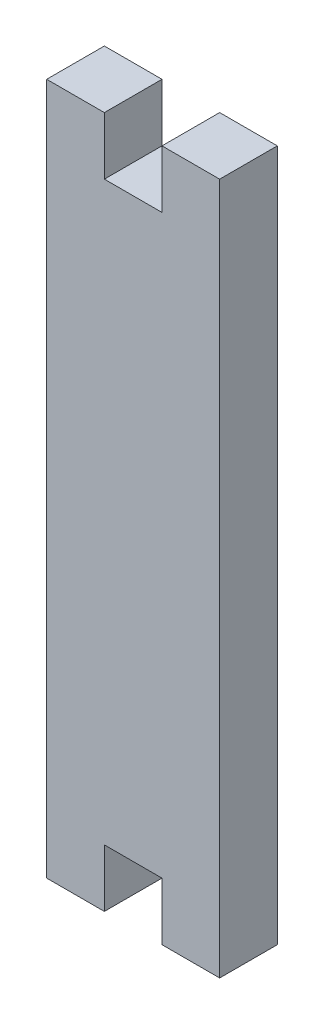
ISO-10303-21;
HEADER;
FILE_DESCRIPTION(('STEP AP214'),'2;1');
FILE_NAME('part.step','',(''),(''),'','','');
FILE_SCHEMA(('AUTOMOTIVE_DESIGN { 1 0 10303 214 1 1 1 1 }'));
ENDSEC;
DATA;
#1=APPLICATION_CONTEXT('core data for automotive mechanical design processes');
#2=APPLICATION_PROTOCOL_DEFINITION('international standard','automotive_design',2000,#1);
#3=PRODUCT_CONTEXT('',#1,'mechanical');
#4=PRODUCT('Part','Part','',(#3));
#5=PRODUCT_RELATED_PRODUCT_CATEGORY('part','',(#4));
#6=PRODUCT_DEFINITION_FORMATION('','',#4);
#7=PRODUCT_DEFINITION_CONTEXT('part definition',#1,'design');
#8=PRODUCT_DEFINITION('design','',#6,#7);
#9=PRODUCT_DEFINITION_SHAPE('','',#8);
#10=(LENGTH_UNIT() NAMED_UNIT(*) SI_UNIT(.MILLI.,.METRE.));
#11=(NAMED_UNIT(*) PLANE_ANGLE_UNIT() SI_UNIT($,.RADIAN.));
#12=(NAMED_UNIT(*) SI_UNIT($,.STERADIAN.) SOLID_ANGLE_UNIT());
#13=UNCERTAINTY_MEASURE_WITH_UNIT(LENGTH_MEASURE(1.E-05),#10,'distance_accuracy_value','');
#14=(GEOMETRIC_REPRESENTATION_CONTEXT(3) GLOBAL_UNCERTAINTY_ASSIGNED_CONTEXT((#13)) GLOBAL_UNIT_ASSIGNED_CONTEXT((#10,
#11,#12)) REPRESENTATION_CONTEXT('',''));
#15=CARTESIAN_POINT('',(0.,0.,0.));
#16=DIRECTION('',(0.,0.,1.));
#17=DIRECTION('',(1.,0.,0.));
#18=AXIS2_PLACEMENT_3D('',#15,#16,#17);
#19=CARTESIAN_POINT('',(0.988883808061497,17.7262943892213,3.));
#20=DIRECTION('',(1.,0.,0.));
#21=DIRECTION('',(0.,0.,-1.));
#22=AXIS2_PLACEMENT_3D('',#19,#20,#21);
#23=PLANE('',#22);
#24=DIRECTION('',(0.,-1.,0.));
#25=VECTOR('',#24,1.);
#26=CARTESIAN_POINT('',(0.988883808061497,17.7262943892213,0.));
#27=LINE('',#26,#25);
#28=CARTESIAN_POINT('',(0.988883808061497,17.7262943892213,0.));
#29=VERTEX_POINT('',#28);
#30=CARTESIAN_POINT('',(0.988883808061497,-18.2737056107787,0.));
#31=VERTEX_POINT('',#30);
#32=EDGE_CURVE('E157',#29,#31,#27,.T.);
#33=ORIENTED_EDGE('',*,*,#32,.T.);
#34=DIRECTION('',(0.,0.,-1.));
#35=VECTOR('',#34,1.);
#36=CARTESIAN_POINT('',(0.988883808061497,-18.2737056107787,3.));
#37=LINE('',#36,#35);
#38=CARTESIAN_POINT('',(0.988883808061497,-18.2737056107787,3.));
#39=VERTEX_POINT('',#38);
#40=EDGE_CURVE('E11',#39,#31,#37,.T.);
#41=ORIENTED_EDGE('',*,*,#40,.F.);
#42=DIRECTION('',(0.,-1.,0.));
#43=VECTOR('',#42,1.);
#44=CARTESIAN_POINT('',(0.988883808061497,17.7262943892213,3.));
#45=LINE('',#44,#43);
#46=CARTESIAN_POINT('',(0.988883808061497,17.7262943892213,3.));
#47=VERTEX_POINT('',#46);
#48=EDGE_CURVE('E179',#47,#39,#45,.T.);
#49=ORIENTED_EDGE('',*,*,#48,.F.);
#50=DIRECTION('',(0.,0.,-1.));
#51=VECTOR('',#50,1.);
#52=CARTESIAN_POINT('',(0.988883808061497,17.7262943892213,3.));
#53=LINE('',#52,#51);
#54=EDGE_CURVE('E153',#47,#29,#53,.T.);
#55=ORIENTED_EDGE('',*,*,#54,.T.);
#56=EDGE_LOOP('',(#33,#41,#49,#55));
#57=FACE_BOUND('',#56,.T.);
#58=ADVANCED_FACE('F37',(#57),#23,.F.);
#59=CARTESIAN_POINT('',(0.988883808061497,-18.2737056107787,3.));
#60=DIRECTION('',(0.,1.,0.));
#61=DIRECTION('',(0.,0.,1.));
#62=AXIS2_PLACEMENT_3D('',#59,#60,#61);
#63=PLANE('',#62);
#64=DIRECTION('',(1.,0.,0.));
#65=VECTOR('',#64,1.);
#66=CARTESIAN_POINT('',(0.988883808061497,-18.2737056107787,0.));
#67=LINE('',#66,#65);
#68=CARTESIAN_POINT('',(3.9888838080615,-18.2737056107787,0.));
#69=VERTEX_POINT('',#68);
#70=EDGE_CURVE('E160',#31,#69,#67,.T.);
#71=ORIENTED_EDGE('',*,*,#70,.T.);
#72=DIRECTION('',(0.,0.,-1.));
#73=VECTOR('',#72,1.);
#74=CARTESIAN_POINT('',(3.9888838080615,-18.2737056107787,3.));
#75=LINE('',#74,#73);
#76=CARTESIAN_POINT('',(3.9888838080615,-18.2737056107787,3.));
#77=VERTEX_POINT('',#76);
#78=EDGE_CURVE('E45',#77,#69,#75,.T.);
#79=ORIENTED_EDGE('',*,*,#78,.F.);
#80=DIRECTION('',(1.,0.,0.));
#81=VECTOR('',#80,1.);
#82=CARTESIAN_POINT('',(0.988883808061497,-18.2737056107787,3.));
#83=LINE('',#82,#81);
#84=EDGE_CURVE('E108',#39,#77,#83,.T.);
#85=ORIENTED_EDGE('',*,*,#84,.F.);
#86=ORIENTED_EDGE('',*,*,#40,.T.);
#87=EDGE_LOOP('',(#71,#79,#85,#86));
#88=FACE_BOUND('',#87,.T.);
#89=ADVANCED_FACE('F257',(#88),#63,.F.);
#90=CARTESIAN_POINT('',(3.9888838080615,-15.2737056107787,3.));
#91=DIRECTION('',(-1.,0.,0.));
#92=DIRECTION('',(0.,0.,1.));
#93=AXIS2_PLACEMENT_3D('',#90,#91,#92);
#94=PLANE('',#93);
#95=DIRECTION('',(0.,1.,0.));
#96=VECTOR('',#95,1.);
#97=CARTESIAN_POINT('',(3.9888838080615,-15.2737056107787,0.));
#98=LINE('',#97,#96);
#99=CARTESIAN_POINT('',(3.9888838080615,-15.2737056107787,0.));
#100=VERTEX_POINT('',#99);
#101=EDGE_CURVE('E162',#69,#100,#98,.T.);
#102=ORIENTED_EDGE('',*,*,#101,.T.);
#103=DIRECTION('',(0.,0.,-1.));
#104=VECTOR('',#103,1.);
#105=CARTESIAN_POINT('',(3.9888838080615,-15.2737056107787,3.));
#106=LINE('',#105,#104);
#107=CARTESIAN_POINT('',(3.9888838080615,-15.2737056107787,3.));
#108=VERTEX_POINT('',#107);
#109=EDGE_CURVE('E198',#108,#100,#106,.T.);
#110=ORIENTED_EDGE('',*,*,#109,.F.);
#111=DIRECTION('',(0.,1.,0.));
#112=VECTOR('',#111,1.);
#113=CARTESIAN_POINT('',(3.9888838080615,-15.2737056107787,3.));
#114=LINE('',#113,#112);
#115=EDGE_CURVE('E206',#77,#108,#114,.T.);
#116=ORIENTED_EDGE('',*,*,#115,.F.);
#117=ORIENTED_EDGE('',*,*,#78,.T.);
#118=EDGE_LOOP('',(#102,#110,#116,#117));
#119=FACE_BOUND('',#118,.T.);
#120=ADVANCED_FACE('F204',(#119),#94,.F.);
#121=CARTESIAN_POINT('',(3.9888838080615,-15.2737056107787,3.));
#122=DIRECTION('',(0.,1.,0.));
#123=DIRECTION('',(-1.,0.,0.));
#124=AXIS2_PLACEMENT_3D('',#121,#122,#123);
#125=PLANE('',#124);
#126=DIRECTION('',(1.,0.,0.));
#127=VECTOR('',#126,1.);
#128=CARTESIAN_POINT('',(3.9888838080615,-15.2737056107787,0.));
#129=LINE('',#128,#127);
#130=CARTESIAN_POINT('',(6.9888838080615,-15.2737056107787,0.));
#131=VERTEX_POINT('',#130);
#132=EDGE_CURVE('E164',#100,#131,#129,.T.);
#133=ORIENTED_EDGE('',*,*,#132,.T.);
#134=DIRECTION('',(0.,0.,-1.));
#135=VECTOR('',#134,1.);
#136=CARTESIAN_POINT('',(6.9888838080615,-15.2737056107787,3.));
#137=LINE('',#136,#135);
#138=CARTESIAN_POINT('',(6.9888838080615,-15.2737056107787,3.));
#139=VERTEX_POINT('',#138);
#140=EDGE_CURVE('E195',#139,#131,#137,.T.);
#141=ORIENTED_EDGE('',*,*,#140,.F.);
#142=DIRECTION('',(1.,0.,0.));
#143=VECTOR('',#142,1.);
#144=CARTESIAN_POINT('',(3.9888838080615,-15.2737056107787,3.));
#145=LINE('',#144,#143);
#146=EDGE_CURVE('E224',#108,#139,#145,.T.);
#147=ORIENTED_EDGE('',*,*,#146,.F.);
#148=ORIENTED_EDGE('',*,*,#109,.T.);
#149=EDGE_LOOP('',(#133,#141,#147,#148));
#150=FACE_BOUND('',#149,.T.);
#151=ADVANCED_FACE('F215',(#150),#125,.F.);
#152=CARTESIAN_POINT('',(6.9888838080615,-15.2737056107787,3.));
#153=DIRECTION('',(1.,0.,0.));
#154=DIRECTION('',(0.,0.,-1.));
#155=AXIS2_PLACEMENT_3D('',#152,#153,#154);
#156=PLANE('',#155);
#157=DIRECTION('',(0.,-1.,0.));
#158=VECTOR('',#157,1.);
#159=CARTESIAN_POINT('',(6.9888838080615,-15.2737056107787,0.));
#160=LINE('',#159,#158);
#161=CARTESIAN_POINT('',(6.9888838080615,-18.2737056107787,0.));
#162=VERTEX_POINT('',#161);
#163=EDGE_CURVE('E166',#131,#162,#160,.T.);
#164=ORIENTED_EDGE('',*,*,#163,.T.);
#165=DIRECTION('',(0.,0.,-1.));
#166=VECTOR('',#165,1.);
#167=CARTESIAN_POINT('',(6.9888838080615,-18.2737056107787,3.));
#168=LINE('',#167,#166);
#169=CARTESIAN_POINT('',(6.9888838080615,-18.2737056107787,3.));
#170=VERTEX_POINT('',#169);
#171=EDGE_CURVE('E192',#170,#162,#168,.T.);
#172=ORIENTED_EDGE('',*,*,#171,.F.);
#173=DIRECTION('',(0.,-1.,0.));
#174=VECTOR('',#173,1.);
#175=CARTESIAN_POINT('',(6.9888838080615,-15.2737056107787,3.));
#176=LINE('',#175,#174);
#177=EDGE_CURVE('E221',#139,#170,#176,.T.);
#178=ORIENTED_EDGE('',*,*,#177,.F.);
#179=ORIENTED_EDGE('',*,*,#140,.T.);
#180=EDGE_LOOP('',(#164,#172,#178,#179));
#181=FACE_BOUND('',#180,.T.);
#182=ADVANCED_FACE('F219',(#181),#156,.F.);
#183=CARTESIAN_POINT('',(6.9888838080615,-18.2737056107787,3.));
#184=DIRECTION('',(0.,1.,0.));
#185=DIRECTION('',(0.,0.,1.));
#186=AXIS2_PLACEMENT_3D('',#183,#184,#185);
#187=PLANE('',#186);
#188=DIRECTION('',(1.,0.,0.));
#189=VECTOR('',#188,1.);
#190=CARTESIAN_POINT('',(6.9888838080615,-18.2737056107787,0.));
#191=LINE('',#190,#189);
#192=CARTESIAN_POINT('',(9.9888838080615,-18.2737056107787,0.));
#193=VERTEX_POINT('',#192);
#194=EDGE_CURVE('E168',#162,#193,#191,.T.);
#195=ORIENTED_EDGE('',*,*,#194,.T.);
#196=DIRECTION('',(0.,0.,-1.));
#197=VECTOR('',#196,1.);
#198=CARTESIAN_POINT('',(9.9888838080615,-18.2737056107787,3.));
#199=LINE('',#198,#197);
#200=CARTESIAN_POINT('',(9.9888838080615,-18.2737056107787,3.));
#201=VERTEX_POINT('',#200);
#202=EDGE_CURVE('E189',#201,#193,#199,.T.);
#203=ORIENTED_EDGE('',*,*,#202,.F.);
#204=DIRECTION('',(1.,0.,0.));
#205=VECTOR('',#204,1.);
#206=CARTESIAN_POINT('',(6.9888838080615,-18.2737056107787,3.));
#207=LINE('',#206,#205);
#208=EDGE_CURVE('E223',#170,#201,#207,.T.);
#209=ORIENTED_EDGE('',*,*,#208,.F.);
#210=ORIENTED_EDGE('',*,*,#171,.T.);
#211=EDGE_LOOP('',(#195,#203,#209,#210));
#212=FACE_BOUND('',#211,.T.);
#213=ADVANCED_FACE('F270',(#212),#187,.F.);
#214=CARTESIAN_POINT('',(9.9888838080615,17.7262943892213,3.));
#215=DIRECTION('',(-1.,0.,0.));
#216=DIRECTION('',(0.,-1.,0.));
#217=AXIS2_PLACEMENT_3D('',#214,#215,#216);
#218=PLANE('',#217);
#219=DIRECTION('',(0.,1.,0.));
#220=VECTOR('',#219,1.);
#221=CARTESIAN_POINT('',(9.9888838080615,17.7262943892213,0.));
#222=LINE('',#221,#220);
#223=CARTESIAN_POINT('',(9.9888838080615,17.7262943892213,0.));
#224=VERTEX_POINT('',#223);
#225=EDGE_CURVE('E170',#193,#224,#222,.T.);
#226=ORIENTED_EDGE('',*,*,#225,.T.);
#227=DIRECTION('',(0.,0.,-1.));
#228=VECTOR('',#227,1.);
#229=CARTESIAN_POINT('',(9.9888838080615,17.7262943892213,3.));
#230=LINE('',#229,#228);
#231=CARTESIAN_POINT('',(9.9888838080615,17.7262943892213,3.));
#232=VERTEX_POINT('',#231);
#233=EDGE_CURVE('E186',#232,#224,#230,.T.);
#234=ORIENTED_EDGE('',*,*,#233,.F.);
#235=DIRECTION('',(0.,1.,0.));
#236=VECTOR('',#235,1.);
#237=CARTESIAN_POINT('',(9.9888838080615,17.7262943892213,3.));
#238=LINE('',#237,#236);
#239=EDGE_CURVE('E226',#201,#232,#238,.T.);
#240=ORIENTED_EDGE('',*,*,#239,.F.);
#241=ORIENTED_EDGE('',*,*,#202,.T.);
#242=EDGE_LOOP('',(#226,#234,#240,#241));
#243=FACE_BOUND('',#242,.T.);
#244=ADVANCED_FACE('F273',(#243),#218,.F.);
#245=CARTESIAN_POINT('',(6.9888838080615,17.7262943892213,3.));
#246=DIRECTION('',(0.,-1.,0.));
#247=DIRECTION('',(0.,0.,-1.));
#248=AXIS2_PLACEMENT_3D('',#245,#246,#247);
#249=PLANE('',#248);
#250=DIRECTION('',(-1.,0.,0.));
#251=VECTOR('',#250,1.);
#252=CARTESIAN_POINT('',(6.9888838080615,17.7262943892213,0.));
#253=LINE('',#252,#251);
#254=CARTESIAN_POINT('',(6.9888838080615,17.7262943892213,0.));
#255=VERTEX_POINT('',#254);
#256=EDGE_CURVE('E172',#224,#255,#253,.T.);
#257=ORIENTED_EDGE('',*,*,#256,.T.);
#258=DIRECTION('',(0.,0.,-1.));
#259=VECTOR('',#258,1.);
#260=CARTESIAN_POINT('',(6.9888838080615,17.7262943892213,3.));
#261=LINE('',#260,#259);
#262=CARTESIAN_POINT('',(6.9888838080615,17.7262943892213,3.));
#263=VERTEX_POINT('',#262);
#264=EDGE_CURVE('E183',#263,#255,#261,.T.);
#265=ORIENTED_EDGE('',*,*,#264,.F.);
#266=DIRECTION('',(-1.,0.,0.));
#267=VECTOR('',#266,1.);
#268=CARTESIAN_POINT('',(6.9888838080615,17.7262943892213,3.));
#269=LINE('',#268,#267);
#270=EDGE_CURVE('E232',#232,#263,#269,.T.);
#271=ORIENTED_EDGE('',*,*,#270,.F.);
#272=ORIENTED_EDGE('',*,*,#233,.T.);
#273=EDGE_LOOP('',(#257,#265,#271,#272));
#274=FACE_BOUND('',#273,.T.);
#275=ADVANCED_FACE('F238',(#274),#249,.F.);
#276=CARTESIAN_POINT('',(6.9888838080615,14.7262943892213,3.));
#277=DIRECTION('',(1.,0.,0.));
#278=DIRECTION('',(0.,1.,0.));
#279=AXIS2_PLACEMENT_3D('',#276,#277,#278);
#280=PLANE('',#279);
#281=DIRECTION('',(0.,-1.,0.));
#282=VECTOR('',#281,1.);
#283=CARTESIAN_POINT('',(6.9888838080615,14.7262943892213,0.));
#284=LINE('',#283,#282);
#285=CARTESIAN_POINT('',(6.9888838080615,14.7262943892213,0.));
#286=VERTEX_POINT('',#285);
#287=EDGE_CURVE('E174',#255,#286,#284,.T.);
#288=ORIENTED_EDGE('',*,*,#287,.T.);
#289=DIRECTION('',(0.,0.,-1.));
#290=VECTOR('',#289,1.);
#291=CARTESIAN_POINT('',(6.9888838080615,14.7262943892213,3.));
#292=LINE('',#291,#290);
#293=CARTESIAN_POINT('',(6.9888838080615,14.7262943892213,3.));
#294=VERTEX_POINT('',#293);
#295=EDGE_CURVE('E148',#294,#286,#292,.T.);
#296=ORIENTED_EDGE('',*,*,#295,.F.);
#297=DIRECTION('',(0.,-1.,0.));
#298=VECTOR('',#297,1.);
#299=CARTESIAN_POINT('',(6.9888838080615,14.7262943892213,3.));
#300=LINE('',#299,#298);
#301=EDGE_CURVE('E139',#263,#294,#300,.T.);
#302=ORIENTED_EDGE('',*,*,#301,.F.);
#303=ORIENTED_EDGE('',*,*,#264,.T.);
#304=EDGE_LOOP('',(#288,#296,#302,#303));
#305=FACE_BOUND('',#304,.T.);
#306=ADVANCED_FACE('F242',(#305),#280,.F.);
#307=CARTESIAN_POINT('',(3.9888838080615,14.7262943892213,3.));
#308=DIRECTION('',(0.,-1.,0.));
#309=DIRECTION('',(0.,0.,-1.));
#310=AXIS2_PLACEMENT_3D('',#307,#308,#309);
#311=PLANE('',#310);
#312=DIRECTION('',(-1.,0.,0.));
#313=VECTOR('',#312,1.);
#314=CARTESIAN_POINT('',(3.9888838080615,14.7262943892213,0.));
#315=LINE('',#314,#313);
#316=CARTESIAN_POINT('',(3.9888838080615,14.7262943892213,0.));
#317=VERTEX_POINT('',#316);
#318=EDGE_CURVE('E147',#286,#317,#315,.T.);
#319=ORIENTED_EDGE('',*,*,#318,.T.);
#320=DIRECTION('',(0.,0.,-1.));
#321=VECTOR('',#320,1.);
#322=CARTESIAN_POINT('',(3.9888838080615,14.7262943892213,3.));
#323=LINE('',#322,#321);
#324=CARTESIAN_POINT('',(3.9888838080615,14.7262943892213,3.));
#325=VERTEX_POINT('',#324);
#326=EDGE_CURVE('E144',#325,#317,#323,.T.);
#327=ORIENTED_EDGE('',*,*,#326,.F.);
#328=DIRECTION('',(-1.,0.,0.));
#329=VECTOR('',#328,1.);
#330=CARTESIAN_POINT('',(3.9888838080615,14.7262943892213,3.));
#331=LINE('',#330,#329);
#332=EDGE_CURVE('E133',#294,#325,#331,.T.);
#333=ORIENTED_EDGE('',*,*,#332,.F.);
#334=ORIENTED_EDGE('',*,*,#295,.T.);
#335=EDGE_LOOP('',(#319,#327,#333,#334));
#336=FACE_BOUND('',#335,.T.);
#337=ADVANCED_FACE('F145',(#336),#311,.F.);
#338=CARTESIAN_POINT('',(3.9888838080615,14.7262943892213,3.));
#339=DIRECTION('',(-1.,0.,0.));
#340=DIRECTION('',(0.,-1.,0.));
#341=AXIS2_PLACEMENT_3D('',#338,#339,#340);
#342=PLANE('',#341);
#343=DIRECTION('',(0.,1.,0.));
#344=VECTOR('',#343,1.);
#345=CARTESIAN_POINT('',(3.9888838080615,14.7262943892213,0.));
#346=LINE('',#345,#344);
#347=CARTESIAN_POINT('',(3.9888838080615,17.7262943892213,0.));
#348=VERTEX_POINT('',#347);
#349=EDGE_CURVE('E94',#317,#348,#346,.T.);
#350=ORIENTED_EDGE('',*,*,#349,.T.);
#351=DIRECTION('',(0.,0.,-1.));
#352=VECTOR('',#351,1.);
#353=CARTESIAN_POINT('',(3.9888838080615,17.7262943892213,3.));
#354=LINE('',#353,#352);
#355=CARTESIAN_POINT('',(3.9888838080615,17.7262943892213,3.));
#356=VERTEX_POINT('',#355);
#357=EDGE_CURVE('E149',#356,#348,#354,.T.);
#358=ORIENTED_EDGE('',*,*,#357,.F.);
#359=DIRECTION('',(0.,1.,0.));
#360=VECTOR('',#359,1.);
#361=CARTESIAN_POINT('',(3.9888838080615,14.7262943892213,3.));
#362=LINE('',#361,#360);
#363=EDGE_CURVE('E137',#325,#356,#362,.T.);
#364=ORIENTED_EDGE('',*,*,#363,.F.);
#365=ORIENTED_EDGE('',*,*,#326,.T.);
#366=EDGE_LOOP('',(#350,#358,#364,#365));
#367=FACE_BOUND('',#366,.T.);
#368=ADVANCED_FACE('F151',(#367),#342,.F.);
#369=CARTESIAN_POINT('',(0.988883808061497,17.7262943892213,3.));
#370=DIRECTION('',(0.,-1.,0.));
#371=DIRECTION('',(0.,0.,-1.));
#372=AXIS2_PLACEMENT_3D('',#369,#370,#371);
#373=PLANE('',#372);
#374=DIRECTION('',(-1.,0.,0.));
#375=VECTOR('',#374,1.);
#376=CARTESIAN_POINT('',(0.988883808061497,17.7262943892213,0.));
#377=LINE('',#376,#375);
#378=EDGE_CURVE('E100',#348,#29,#377,.T.);
#379=ORIENTED_EDGE('',*,*,#378,.T.);
#380=ORIENTED_EDGE('',*,*,#54,.F.);
#381=DIRECTION('',(-1.,0.,0.));
#382=VECTOR('',#381,1.);
#383=CARTESIAN_POINT('',(0.988883808061497,17.7262943892213,3.));
#384=LINE('',#383,#382);
#385=EDGE_CURVE('E53',#356,#47,#384,.T.);
#386=ORIENTED_EDGE('',*,*,#385,.F.);
#387=ORIENTED_EDGE('',*,*,#357,.T.);
#388=EDGE_LOOP('',(#379,#380,#386,#387));
#389=FACE_BOUND('',#388,.T.);
#390=ADVANCED_FACE('F246',(#389),#373,.F.);
#391=CARTESIAN_POINT('',(0.,0.,3.));
#392=DIRECTION('',(0.,0.,1.));
#393=DIRECTION('',(1.,0.,0.));
#394=AXIS2_PLACEMENT_3D('',#391,#392,#393);
#395=PLANE('',#394);
#396=ORIENTED_EDGE('',*,*,#48,.T.);
#397=ORIENTED_EDGE('',*,*,#84,.T.);
#398=ORIENTED_EDGE('',*,*,#115,.T.);
#399=ORIENTED_EDGE('',*,*,#146,.T.);
#400=ORIENTED_EDGE('',*,*,#177,.T.);
#401=ORIENTED_EDGE('',*,*,#208,.T.);
#402=ORIENTED_EDGE('',*,*,#239,.T.);
#403=ORIENTED_EDGE('',*,*,#270,.T.);
#404=ORIENTED_EDGE('',*,*,#301,.T.);
#405=ORIENTED_EDGE('',*,*,#332,.T.);
#406=ORIENTED_EDGE('',*,*,#363,.T.);
#407=ORIENTED_EDGE('',*,*,#385,.T.);
#408=EDGE_LOOP('',(#396,#397,#398,#399,#400,#401,#402,#403,#404,#405,#406,#407));
#409=FACE_BOUND('',#408,.T.);
#410=ADVANCED_FACE('F135',(#409),#395,.T.);
#411=CARTESIAN_POINT('',(0.,0.,0.));
#412=DIRECTION('',(0.,0.,1.));
#413=DIRECTION('',(1.,0.,0.));
#414=AXIS2_PLACEMENT_3D('',#411,#412,#413);
#415=PLANE('',#414);
#416=ORIENTED_EDGE('',*,*,#32,.F.);
#417=ORIENTED_EDGE('',*,*,#378,.F.);
#418=ORIENTED_EDGE('',*,*,#349,.F.);
#419=ORIENTED_EDGE('',*,*,#318,.F.);
#420=ORIENTED_EDGE('',*,*,#287,.F.);
#421=ORIENTED_EDGE('',*,*,#256,.F.);
#422=ORIENTED_EDGE('',*,*,#225,.F.);
#423=ORIENTED_EDGE('',*,*,#194,.F.);
#424=ORIENTED_EDGE('',*,*,#163,.F.);
#425=ORIENTED_EDGE('',*,*,#132,.F.);
#426=ORIENTED_EDGE('',*,*,#101,.F.);
#427=ORIENTED_EDGE('',*,*,#70,.F.);
#428=EDGE_LOOP('',(#416,#417,#418,#419,#420,#421,#422,#423,#424,#425,#426,#427));
#429=FACE_BOUND('',#428,.T.);
#430=ADVANCED_FACE('F210',(#429),#415,.F.);
#431=CLOSED_SHELL('',(#58,#89,#120,#151,#182,#213,#244,#275,#306,#337,#368,#390,#410,#430));
#432=MANIFOLD_SOLID_BREP('B2',#431);
#433=ADVANCED_BREP_SHAPE_REPRESENTATION('',(#18,#432),#14);
#434=SHAPE_DEFINITION_REPRESENTATION(#9,#433);
ENDSEC;
END-ISO-10303-21;
